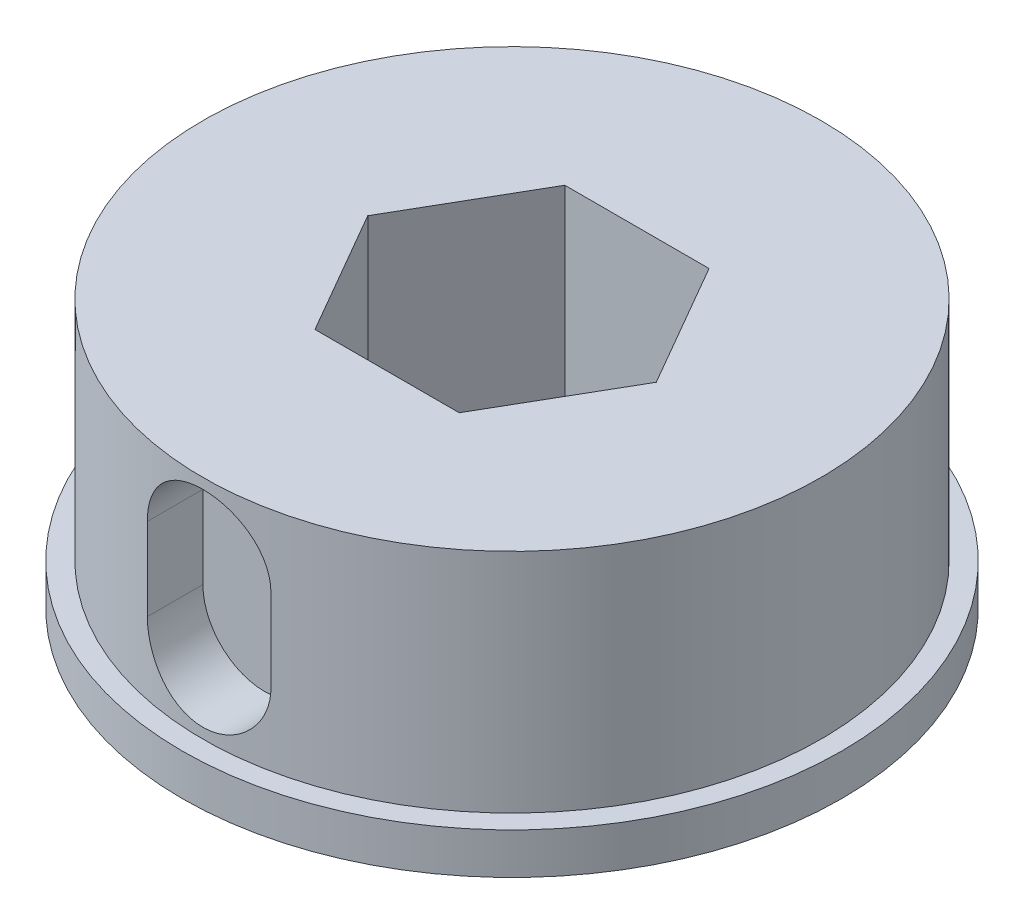
ISO-10303-21;
HEADER;
FILE_DESCRIPTION(('STEP AP214'),'2;1');
FILE_NAME('part.step','',(''),(''),'','','');
FILE_SCHEMA(('AUTOMOTIVE_DESIGN { 1 0 10303 214 1 1 1 1 }'));
ENDSEC;
DATA;
#1=APPLICATION_CONTEXT('core data for automotive mechanical design processes');
#2=APPLICATION_PROTOCOL_DEFINITION('international standard','automotive_design',2000,#1);
#3=PRODUCT_CONTEXT('',#1,'mechanical');
#4=PRODUCT('Part','Part','',(#3));
#5=PRODUCT_RELATED_PRODUCT_CATEGORY('part','',(#4));
#6=PRODUCT_DEFINITION_FORMATION('','',#4);
#7=PRODUCT_DEFINITION_CONTEXT('part definition',#1,'design');
#8=PRODUCT_DEFINITION('design','',#6,#7);
#9=PRODUCT_DEFINITION_SHAPE('','',#8);
#10=(LENGTH_UNIT() NAMED_UNIT(*) SI_UNIT(.MILLI.,.METRE.));
#11=(NAMED_UNIT(*) PLANE_ANGLE_UNIT() SI_UNIT($,.RADIAN.));
#12=(NAMED_UNIT(*) SI_UNIT($,.STERADIAN.) SOLID_ANGLE_UNIT());
#13=UNCERTAINTY_MEASURE_WITH_UNIT(LENGTH_MEASURE(1.E-05),#10,'distance_accuracy_value','');
#14=(GEOMETRIC_REPRESENTATION_CONTEXT(3) GLOBAL_UNCERTAINTY_ASSIGNED_CONTEXT((#13)) GLOBAL_UNIT_ASSIGNED_CONTEXT((#10,
#11,#12)) REPRESENTATION_CONTEXT('',''));
#15=CARTESIAN_POINT('',(0.,0.,0.));
#16=DIRECTION('',(0.,0.,1.));
#17=DIRECTION('',(1.,0.,0.));
#18=AXIS2_PLACEMENT_3D('',#15,#16,#17);
#19=CARTESIAN_POINT('',(0.,13.,0.));
#20=DIRECTION('',(0.,1.,0.));
#21=DIRECTION('',(0.,0.,1.));
#22=AXIS2_PLACEMENT_3D('',#19,#20,#21);
#23=PLANE('',#22);
#24=DIRECTION('',(-0.5,0.,0.866025403784438));
#25=VECTOR('',#24,1.);
#26=CARTESIAN_POINT('',(-3.5,13.,-6.06217782649107));
#27=LINE('',#26,#25);
#28=CARTESIAN_POINT('',(-3.5,13.,-6.06217782649107));
#29=VERTEX_POINT('',#28);
#30=CARTESIAN_POINT('',(-7.,13.,0.));
#31=VERTEX_POINT('',#30);
#32=EDGE_CURVE('E61',#29,#31,#27,.T.);
#33=ORIENTED_EDGE('',*,*,#32,.F.);
#34=DIRECTION('',(-1.,0.,0.));
#35=VECTOR('',#34,1.);
#36=CARTESIAN_POINT('',(3.5,13.,-6.06217782649107));
#37=LINE('',#36,#35);
#38=CARTESIAN_POINT('',(3.5,13.,-6.06217782649107));
#39=VERTEX_POINT('',#38);
#40=EDGE_CURVE('E158',#39,#29,#37,.T.);
#41=ORIENTED_EDGE('',*,*,#40,.F.);
#42=DIRECTION('',(-0.5,0.,-0.866025403784439));
#43=VECTOR('',#42,1.);
#44=CARTESIAN_POINT('',(7.,13.,0.));
#45=LINE('',#44,#43);
#46=CARTESIAN_POINT('',(7.,13.,0.));
#47=VERTEX_POINT('',#46);
#48=EDGE_CURVE('E193',#47,#39,#45,.T.);
#49=ORIENTED_EDGE('',*,*,#48,.F.);
#50=DIRECTION('',(0.500000000000001,0.,-0.866025403784438));
#51=VECTOR('',#50,1.);
#52=CARTESIAN_POINT('',(3.49999999999999,13.,6.06217782649107));
#53=LINE('',#52,#51);
#54=CARTESIAN_POINT('',(3.49999999999999,13.,6.06217782649107));
#55=VERTEX_POINT('',#54);
#56=EDGE_CURVE('E189',#55,#47,#53,.T.);
#57=ORIENTED_EDGE('',*,*,#56,.F.);
#58=DIRECTION('',(1.,0.,0.));
#59=VECTOR('',#58,1.);
#60=CARTESIAN_POINT('',(-3.5,13.,6.06217782649107));
#61=LINE('',#60,#59);
#62=CARTESIAN_POINT('',(-3.5,13.,6.06217782649107));
#63=VERTEX_POINT('',#62);
#64=EDGE_CURVE('E185',#63,#55,#61,.T.);
#65=ORIENTED_EDGE('',*,*,#64,.F.);
#66=DIRECTION('',(0.5,0.,0.866025403784439));
#67=VECTOR('',#66,1.);
#68=CARTESIAN_POINT('',(-7.,13.,0.));
#69=LINE('',#68,#67);
#70=EDGE_CURVE('E181',#31,#63,#69,.T.);
#71=ORIENTED_EDGE('',*,*,#70,.F.);
#72=EDGE_LOOP('',(#33,#41,#49,#57,#65,#71));
#73=FACE_BOUND('',#72,.T.);
#74=CARTESIAN_POINT('',(0.,13.,0.));
#75=DIRECTION('',(0.,-1.,0.));
#76=DIRECTION('',(0.,0.,-1.));
#77=AXIS2_PLACEMENT_3D('',#74,#75,#76);
#78=CIRCLE('',#77,15.);
#79=CARTESIAN_POINT('',(0.,13.,-15.));
#80=VERTEX_POINT('',#79);
#81=EDGE_CURVE('E229',#80,#80,#78,.T.);
#82=ORIENTED_EDGE('',*,*,#81,.F.);
#83=EDGE_LOOP('',(#82));
#84=FACE_BOUND('',#83,.T.);
#85=ADVANCED_FACE('F39',(#73,#84),#23,.T.);
#86=CARTESIAN_POINT('',(0.,0.,0.));
#87=DIRECTION('',(0.,-1.,0.));
#88=DIRECTION('',(0.,0.,-1.));
#89=AXIS2_PLACEMENT_3D('',#86,#87,#88);
#90=CYLINDRICAL_SURFACE('',#89,15.);
#91=CARTESIAN_POINT('',(-3.,5.5,14.6969384566991));
#92=CARTESIAN_POINT('',(-3.0000090632729,5.41652319142146,14.6969312244577));
#93=CARTESIAN_POINT('',(-2.99651591463672,5.33305138973831,14.6976495056175));
#94=CARTESIAN_POINT('',(-2.98259549441824,5.16672190003094,14.7004835434339));
#95=CARTESIAN_POINT('',(-2.97216908062491,5.08386413731945,14.7025991272148));
#96=CARTESIAN_POINT('',(-2.94447346178658,4.91947090401734,14.708170006848));
#97=CARTESIAN_POINT('',(-2.92721468106147,4.8379336151037,14.7116232616092));
#98=CARTESIAN_POINT('',(-2.88600721568467,4.67665358729654,14.7197622168639));
#99=CARTESIAN_POINT('',(-2.86205850372287,4.59691085573031,14.7244479223887));
#100=CARTESIAN_POINT('',(-2.78041527952091,4.36119429438503,14.7401631005323));
#101=CARTESIAN_POINT('',(-2.71290158046862,4.20860194204345,14.7528553636172));
#102=CARTESIAN_POINT('',(-2.55375565119918,3.91697261725373,14.7812320879208));
#103=CARTESIAN_POINT('',(-2.46212092124304,3.77793705178617,14.7969168592162));
#104=CARTESIAN_POINT('',(-2.25594334606256,3.51532942204371,14.829758124629));
#105=CARTESIAN_POINT('',(-2.14112719277709,3.39197354751699,14.8469306312349));
#106=CARTESIAN_POINT('',(-1.89243128558792,3.16613428756158,14.8806728038384));
#107=CARTESIAN_POINT('',(-1.75854858340981,3.06365413612862,14.8972423761055));
#108=CARTESIAN_POINT('',(-1.47408029245692,2.88163394701367,14.9280843032166));
#109=CARTESIAN_POINT('',(-1.32335950974471,2.80230126638314,14.9423354158867));
#110=CARTESIAN_POINT('',(-1.01040357091221,2.67017217235637,14.9667526662081));
#111=CARTESIAN_POINT('',(-0.848170122016177,2.61737183379913,14.9769194080515));
#112=CARTESIAN_POINT('',(-0.519052235967758,2.54047890031659,14.9919095326336));
#113=CARTESIAN_POINT('',(-0.352257106220375,2.5160176437936,14.996801475465));
#114=CARTESIAN_POINT('',(-0.0168596277551957,2.49534704944041,15.0009276525647));
#115=CARTESIAN_POINT('',(0.151742587839112,2.49913564460563,15.0001623007697));
#116=CARTESIAN_POINT('',(0.483426607616181,2.53457860432744,14.9931130332671));
#117=CARTESIAN_POINT('',(0.646552839896437,2.56583515057533,14.9869079049386));
#118=CARTESIAN_POINT('',(0.965196019837504,2.65469553006709,14.9697652350655));
#119=CARTESIAN_POINT('',(1.12071271847092,2.71230022493534,14.9588275387594));
#120=CARTESIAN_POINT('',(1.42086081389148,2.8525912107189,14.9333186736123));
#121=CARTESIAN_POINT('',(1.56541718043671,2.9354337608403,14.918724971732));
#122=CARTESIAN_POINT('',(1.83871931366189,3.12373081076761,14.8875135488761));
#123=CARTESIAN_POINT('',(1.96746376866397,3.22918718451439,14.8708956602115));
#124=CARTESIAN_POINT('',(2.20783861961223,3.46188508489282,14.8371311210549));
#125=CARTESIAN_POINT('',(2.31913408498718,3.58947220621929,14.8199802972521));
#126=CARTESIAN_POINT('',(2.51883269969928,3.86171427546206,14.7873511834928));
#127=CARTESIAN_POINT('',(2.60722950726484,4.00637393549751,14.7718733575622));
#128=CARTESIAN_POINT('',(2.75873986393405,4.30915721483898,14.7443319012696));
#129=CARTESIAN_POINT('',(2.82178462990343,4.46731607019005,14.7322775849504));
#130=CARTESIAN_POINT('',(2.9202212919898,4.79217589376674,14.7130848318748));
#131=CARTESIAN_POINT('',(2.95565438245299,4.95886373994435,14.7059390738486));
#132=CARTESIAN_POINT('',(2.98449881436589,5.18907045053933,14.7000953157589));
#133=CARTESIAN_POINT('',(2.99031376696653,5.25116241934733,14.6989127961598));
#134=CARTESIAN_POINT('',(2.99805949399395,5.37549359241226,14.6973350216032));
#135=CARTESIAN_POINT('',(2.99999676871396,5.43773237486735,14.6969384491447));
#136=CARTESIAN_POINT('',(3.,5.5,14.6969384566991));
#137=B_SPLINE_CURVE_WITH_KNOTS('',3,(#91,#92,#93,#94,#95,#96,#97,#98,#99,#100,#101,#102,#103,
#104,#105,#106,#107,#108,#109,#110,#111,#112,#113,#114,#115,#116,#117,#118,#119,#120,#121,#122,
#123,#124,#125,#126,#127,#128,#129,#130,#131,#132,#133,#134,#135,#136),.UNSPECIFIED.,.F.,.F.,(4,
2,2,2,2,2,2,2,2,2,2,2,2,2,2,2,2,2,2,2,2,2,4),(0.,0.250345531073763,0.500660094964607,
0.750594210284376,1.00052934591733,1.5000082936227,1.99953902430944,2.50534477833306,
3.01122883056535,3.52151451068939,4.03172467755666,4.53522025544509,5.03867899358442,
5.53496413269304,6.03126550223829,6.53070440104676,7.03018470288859,7.53831354930086,
8.04658297164637,8.55622223384239,9.06509969273805,9.25212746067475,9.43884144366995),.UNSPECIFIED.);
#138=CARTESIAN_POINT('',(-3.,5.5,14.6969384566991));
#139=VERTEX_POINT('',#138);
#140=CARTESIAN_POINT('',(3.,5.5,14.6969384566991));
#141=VERTEX_POINT('',#140);
#142=EDGE_CURVE('E233',#139,#141,#137,.T.);
#143=ORIENTED_EDGE('',*,*,#142,.F.);
#144=DIRECTION('',(0.,-1.,0.));
#145=VECTOR('',#144,1.);
#146=CARTESIAN_POINT('',(-3.,0.,14.6969384566991));
#147=LINE('',#146,#145);
#148=CARTESIAN_POINT('',(-3.,9.5,14.6969384566991));
#149=VERTEX_POINT('',#148);
#150=EDGE_CURVE('E11',#149,#139,#147,.T.);
#151=ORIENTED_EDGE('',*,*,#150,.F.);
#152=CARTESIAN_POINT('',(3.,9.50000000000001,14.6969384566991));
#153=CARTESIAN_POINT('',(3.00000906327289,9.58347680857855,14.6969312244577));
#154=CARTESIAN_POINT('',(2.99651591463671,9.6669486102617,14.6976495056175));
#155=CARTESIAN_POINT('',(2.98259549441823,9.83327809996907,14.7004835434339));
#156=CARTESIAN_POINT('',(2.97216908062491,9.91613586268056,14.7025991272148));
#157=CARTESIAN_POINT('',(2.94447346178657,10.0805290959827,14.708170006848));
#158=CARTESIAN_POINT('',(2.92721468106147,10.1620663848963,14.7116232616092));
#159=CARTESIAN_POINT('',(2.88600721568466,10.3233464127035,14.7197622168639));
#160=CARTESIAN_POINT('',(2.86205850372286,10.4030891442697,14.7244479223887));
#161=CARTESIAN_POINT('',(2.7804152795209,10.638805705615,14.7401631005323));
#162=CARTESIAN_POINT('',(2.71290158046861,10.7913980579566,14.7528553636172));
#163=CARTESIAN_POINT('',(2.55375565119917,11.0830273827463,14.7812320879208));
#164=CARTESIAN_POINT('',(2.46212092124303,11.2220629482138,14.7969168592162));
#165=CARTESIAN_POINT('',(2.25594334606254,11.4846705779563,14.829758124629));
#166=CARTESIAN_POINT('',(2.14112719277708,11.608026452483,14.8469306312349));
#167=CARTESIAN_POINT('',(1.8924312855879,11.8338657124384,14.8806728038384));
#168=CARTESIAN_POINT('',(1.7585485834098,11.9363458638714,14.8972423761055));
#169=CARTESIAN_POINT('',(1.47408029245691,12.1183660529863,14.9280843032166));
#170=CARTESIAN_POINT('',(1.32335950974469,12.1976987336169,14.9423354158867));
#171=CARTESIAN_POINT('',(1.01040357091219,12.3298278276436,14.9667526662081));
#172=CARTESIAN_POINT('',(0.848170122016159,12.3826281662009,14.9769194080515));
#173=CARTESIAN_POINT('',(0.51905223596774,12.4595210996834,14.9919095326336));
#174=CARTESIAN_POINT('',(0.352257106220357,12.4839823562064,14.996801475465));
#175=CARTESIAN_POINT('',(0.0168596277551778,12.5046529505596,15.0009276525647));
#176=CARTESIAN_POINT('',(-0.15174258783913,12.5008643553944,15.0001623007697));
#177=CARTESIAN_POINT('',(-0.483426607616199,12.4654213956726,14.9931130332671));
#178=CARTESIAN_POINT('',(-0.646552839896454,12.4341648494247,14.9869079049386));
#179=CARTESIAN_POINT('',(-0.965196019837522,12.3453044699329,14.9697652350655));
#180=CARTESIAN_POINT('',(-1.12071271847093,12.2876997750647,14.9588275387594));
#181=CARTESIAN_POINT('',(-1.4208608138915,12.1474087892811,14.9333186736123));
#182=CARTESIAN_POINT('',(-1.56541718043672,12.0645662391597,14.918724971732));
#183=CARTESIAN_POINT('',(-1.8387193136619,11.8762691892324,14.8875135488761));
#184=CARTESIAN_POINT('',(-1.96746376866399,11.7708128154856,14.8708956602115));
#185=CARTESIAN_POINT('',(-2.20783861961224,11.5381149151072,14.8371311210549));
#186=CARTESIAN_POINT('',(-2.3191340849872,11.4105277937807,14.8199802972521));
#187=CARTESIAN_POINT('',(-2.51883269969929,11.1382857245379,14.7873511834928));
#188=CARTESIAN_POINT('',(-2.60722950726485,10.9936260645025,14.7718733575622));
#189=CARTESIAN_POINT('',(-2.75873986393406,10.690842785161,14.7443319012696));
#190=CARTESIAN_POINT('',(-2.82178462990344,10.5326839298099,14.7322775849504));
#191=CARTESIAN_POINT('',(-2.92022129198981,10.2078241062333,14.7130848318748));
#192=CARTESIAN_POINT('',(-2.955654382453,10.0411362600556,14.7059390738486));
#193=CARTESIAN_POINT('',(-2.9844988143659,9.81092954946066,14.7000953157589));
#194=CARTESIAN_POINT('',(-2.99031376696654,9.74883758065267,14.6989127961598));
#195=CARTESIAN_POINT('',(-2.99805949399396,9.62450640758774,14.6973350216032));
#196=CARTESIAN_POINT('',(-2.99999676871397,9.56226762513266,14.6969384491447));
#197=CARTESIAN_POINT('',(-3.,9.5,14.6969384566991));
#198=B_SPLINE_CURVE_WITH_KNOTS('',3,(#152,#153,#154,#155,#156,#157,#158,#159,#160,#161,#162,
#163,#164,#165,#166,#167,#168,#169,#170,#171,#172,#173,#174,#175,#176,#177,#178,#179,#180,#181,
#182,#183,#184,#185,#186,#187,#188,#189,#190,#191,#192,#193,#194,#195,#196,#197),.UNSPECIFIED.,
.F.,.F.,(4,2,2,2,2,2,2,2,2,2,2,2,2,2,2,2,2,2,2,2,2,2,4),(0.,0.250345531073763,0.500660094964607,
0.750594210284378,1.00052934591733,1.5000082936227,1.99953902430944,2.50534477833307,
3.01122883056536,3.52151451068939,4.03172467755667,4.53522025544509,5.03867899358442,
5.53496413269305,6.03126550223829,6.53070440104676,7.03018470288859,7.53831354930087,
8.04658297164638,8.5562222338424,9.06509969273806,9.25212746067475,9.43884144366994),.UNSPECIFIED.);
#199=CARTESIAN_POINT('',(3.,9.50000000000001,14.6969384566991));
#200=VERTEX_POINT('',#199);
#201=EDGE_CURVE('E47',#200,#149,#198,.T.);
#202=ORIENTED_EDGE('',*,*,#201,.F.);
#203=DIRECTION('',(0.,-1.,0.));
#204=VECTOR('',#203,1.);
#205=CARTESIAN_POINT('',(3.,0.,14.6969384566991));
#206=LINE('',#205,#204);
#207=EDGE_CURVE('E241',#141,#200,#206,.F.);
#208=ORIENTED_EDGE('',*,*,#207,.F.);
#209=EDGE_LOOP('',(#143,#151,#202,#208));
#210=FACE_BOUND('',#209,.T.);
#211=ORIENTED_EDGE('',*,*,#81,.T.);
#212=EDGE_LOOP('',(#211));
#213=FACE_BOUND('',#212,.T.);
#214=CARTESIAN_POINT('',(0.,2.,0.));
#215=DIRECTION('',(0.,-1.,0.));
#216=DIRECTION('',(0.,0.,-1.));
#217=AXIS2_PLACEMENT_3D('',#214,#215,#216);
#218=CIRCLE('',#217,15.);
#219=CARTESIAN_POINT('',(0.,2.,-15.));
#220=VERTEX_POINT('',#219);
#221=EDGE_CURVE('E225',#220,#220,#218,.T.);
#222=ORIENTED_EDGE('',*,*,#221,.F.);
#223=EDGE_LOOP('',(#222));
#224=FACE_BOUND('',#223,.T.);
#225=ADVANCED_FACE('F242',(#210,#213,#224),#90,.T.);
#226=CARTESIAN_POINT('',(15.,2.,0.));
#227=DIRECTION('',(0.,1.,0.));
#228=DIRECTION('',(0.,0.,1.));
#229=AXIS2_PLACEMENT_3D('',#226,#227,#228);
#230=PLANE('',#229);
#231=ORIENTED_EDGE('',*,*,#221,.T.);
#232=EDGE_LOOP('',(#231));
#233=FACE_BOUND('',#232,.T.);
#234=CARTESIAN_POINT('',(0.,2.,0.));
#235=DIRECTION('',(0.,-1.,0.));
#236=DIRECTION('',(0.,0.,-1.));
#237=AXIS2_PLACEMENT_3D('',#234,#235,#236);
#238=CIRCLE('',#237,16.);
#239=CARTESIAN_POINT('',(0.,2.,-16.));
#240=VERTEX_POINT('',#239);
#241=EDGE_CURVE('E221',#240,#240,#238,.T.);
#242=ORIENTED_EDGE('',*,*,#241,.F.);
#243=EDGE_LOOP('',(#242));
#244=FACE_BOUND('',#243,.T.);
#245=ADVANCED_FACE('F273',(#233,#244),#230,.T.);
#246=CARTESIAN_POINT('',(0.,0.,0.));
#247=DIRECTION('',(0.,-1.,0.));
#248=DIRECTION('',(0.,0.,-1.));
#249=AXIS2_PLACEMENT_3D('',#246,#247,#248);
#250=CYLINDRICAL_SURFACE('',#249,16.);
#251=ORIENTED_EDGE('',*,*,#241,.T.);
#252=EDGE_LOOP('',(#251));
#253=FACE_BOUND('',#252,.T.);
#254=CARTESIAN_POINT('',(0.,0.,0.));
#255=DIRECTION('',(0.,-1.,0.));
#256=DIRECTION('',(0.,0.,-1.));
#257=AXIS2_PLACEMENT_3D('',#254,#255,#256);
#258=CIRCLE('',#257,16.);
#259=CARTESIAN_POINT('',(0.,0.,-16.));
#260=VERTEX_POINT('',#259);
#261=EDGE_CURVE('E203',#260,#260,#258,.T.);
#262=ORIENTED_EDGE('',*,*,#261,.F.);
#263=EDGE_LOOP('',(#262));
#264=FACE_BOUND('',#263,.T.);
#265=ADVANCED_FACE('F280',(#253,#264),#250,.T.);
#266=CARTESIAN_POINT('',(16.,0.,0.));
#267=DIRECTION('',(0.,-1.,0.));
#268=DIRECTION('',(0.,0.,-1.));
#269=AXIS2_PLACEMENT_3D('',#266,#267,#268);
#270=PLANE('',#269);
#271=DIRECTION('',(-0.5,0.,0.866025403784438));
#272=VECTOR('',#271,1.);
#273=CARTESIAN_POINT('',(-3.5,0.,-6.06217782649107));
#274=LINE('',#273,#272);
#275=CARTESIAN_POINT('',(-3.5,0.,-6.06217782649107));
#276=VERTEX_POINT('',#275);
#277=CARTESIAN_POINT('',(-7.,0.,0.));
#278=VERTEX_POINT('',#277);
#279=EDGE_CURVE('E153',#276,#278,#274,.T.);
#280=ORIENTED_EDGE('',*,*,#279,.T.);
#281=DIRECTION('',(0.5,0.,0.866025403784439));
#282=VECTOR('',#281,1.);
#283=CARTESIAN_POINT('',(-7.,0.,0.));
#284=LINE('',#283,#282);
#285=CARTESIAN_POINT('',(-3.5,0.,6.06217782649107));
#286=VERTEX_POINT('',#285);
#287=EDGE_CURVE('E157',#278,#286,#284,.T.);
#288=ORIENTED_EDGE('',*,*,#287,.T.);
#289=DIRECTION('',(1.,0.,0.));
#290=VECTOR('',#289,1.);
#291=CARTESIAN_POINT('',(-3.5,0.,6.06217782649107));
#292=LINE('',#291,#290);
#293=CARTESIAN_POINT('',(3.49999999999999,0.,6.06217782649107));
#294=VERTEX_POINT('',#293);
#295=EDGE_CURVE('E162',#286,#294,#292,.T.);
#296=ORIENTED_EDGE('',*,*,#295,.T.);
#297=DIRECTION('',(0.500000000000001,0.,-0.866025403784438));
#298=VECTOR('',#297,1.);
#299=CARTESIAN_POINT('',(3.49999999999999,0.,6.06217782649107));
#300=LINE('',#299,#298);
#301=CARTESIAN_POINT('',(7.,0.,0.));
#302=VERTEX_POINT('',#301);
#303=EDGE_CURVE('E166',#294,#302,#300,.T.);
#304=ORIENTED_EDGE('',*,*,#303,.T.);
#305=DIRECTION('',(-0.5,0.,-0.866025403784439));
#306=VECTOR('',#305,1.);
#307=CARTESIAN_POINT('',(7.,0.,0.));
#308=LINE('',#307,#306);
#309=CARTESIAN_POINT('',(3.5,0.,-6.06217782649107));
#310=VERTEX_POINT('',#309);
#311=EDGE_CURVE('E170',#302,#310,#308,.T.);
#312=ORIENTED_EDGE('',*,*,#311,.T.);
#313=DIRECTION('',(-1.,0.,0.));
#314=VECTOR('',#313,1.);
#315=CARTESIAN_POINT('',(3.5,0.,-6.06217782649107));
#316=LINE('',#315,#314);
#317=EDGE_CURVE('E174',#310,#276,#316,.T.);
#318=ORIENTED_EDGE('',*,*,#317,.T.);
#319=EDGE_LOOP('',(#280,#288,#296,#304,#312,#318));
#320=FACE_BOUND('',#319,.T.);
#321=ORIENTED_EDGE('',*,*,#261,.T.);
#322=EDGE_LOOP('',(#321));
#323=FACE_BOUND('',#322,.T.);
#324=ADVANCED_FACE('F285',(#320,#323),#270,.T.);
#325=CARTESIAN_POINT('',(-3.5,0.,-6.06217782649107));
#326=DIRECTION('',(-0.866025403784439,0.,-0.5));
#327=DIRECTION('',(-0.5,0.,0.866025403784439));
#328=AXIS2_PLACEMENT_3D('',#325,#326,#327);
#329=PLANE('',#328);
#330=ORIENTED_EDGE('',*,*,#32,.T.);
#331=DIRECTION('',(0.,1.,0.));
#332=VECTOR('',#331,1.);
#333=CARTESIAN_POINT('',(-7.,0.,0.));
#334=LINE('',#333,#332);
#335=EDGE_CURVE('E178',#278,#31,#334,.T.);
#336=ORIENTED_EDGE('',*,*,#335,.F.);
#337=ORIENTED_EDGE('',*,*,#279,.F.);
#338=DIRECTION('',(0.,1.,0.));
#339=VECTOR('',#338,1.);
#340=CARTESIAN_POINT('',(-3.5,0.,-6.06217782649107));
#341=LINE('',#340,#339);
#342=EDGE_CURVE('E200',#276,#29,#341,.T.);
#343=ORIENTED_EDGE('',*,*,#342,.T.);
#344=EDGE_LOOP('',(#330,#336,#337,#343));
#345=FACE_BOUND('',#344,.T.);
#346=ADVANCED_FACE('F290',(#345),#329,.F.);
#347=CARTESIAN_POINT('',(3.5,0.,-6.06217782649107));
#348=DIRECTION('',(0.,0.,-1.));
#349=DIRECTION('',(-1.,0.,0.));
#350=AXIS2_PLACEMENT_3D('',#347,#348,#349);
#351=PLANE('',#350);
#352=ORIENTED_EDGE('',*,*,#40,.T.);
#353=ORIENTED_EDGE('',*,*,#342,.F.);
#354=ORIENTED_EDGE('',*,*,#317,.F.);
#355=DIRECTION('',(0.,1.,0.));
#356=VECTOR('',#355,1.);
#357=CARTESIAN_POINT('',(3.5,0.,-6.06217782649107));
#358=LINE('',#357,#356);
#359=EDGE_CURVE('E204',#310,#39,#358,.T.);
#360=ORIENTED_EDGE('',*,*,#359,.T.);
#361=EDGE_LOOP('',(#352,#353,#354,#360));
#362=FACE_BOUND('',#361,.T.);
#363=ADVANCED_FACE('F259',(#362),#351,.F.);
#364=CARTESIAN_POINT('',(7.,0.,0.));
#365=DIRECTION('',(0.866025403784439,0.,-0.5));
#366=DIRECTION('',(-0.5,0.,-0.866025403784439));
#367=AXIS2_PLACEMENT_3D('',#364,#365,#366);
#368=PLANE('',#367);
#369=ORIENTED_EDGE('',*,*,#48,.T.);
#370=ORIENTED_EDGE('',*,*,#359,.F.);
#371=ORIENTED_EDGE('',*,*,#311,.F.);
#372=DIRECTION('',(0.,1.,0.));
#373=VECTOR('',#372,1.);
#374=CARTESIAN_POINT('',(7.,0.,0.));
#375=LINE('',#374,#373);
#376=EDGE_CURVE('E207',#302,#47,#375,.T.);
#377=ORIENTED_EDGE('',*,*,#376,.T.);
#378=EDGE_LOOP('',(#369,#370,#371,#377));
#379=FACE_BOUND('',#378,.T.);
#380=ADVANCED_FACE('F315',(#379),#368,.F.);
#381=CARTESIAN_POINT('',(3.49999999999999,0.,6.06217782649107));
#382=DIRECTION('',(0.866025403784438,0.,0.500000000000001));
#383=DIRECTION('',(0.500000000000001,0.,-0.866025403784438));
#384=AXIS2_PLACEMENT_3D('',#381,#382,#383);
#385=PLANE('',#384);
#386=ORIENTED_EDGE('',*,*,#56,.T.);
#387=ORIENTED_EDGE('',*,*,#376,.F.);
#388=ORIENTED_EDGE('',*,*,#303,.F.);
#389=DIRECTION('',(0.,1.,0.));
#390=VECTOR('',#389,1.);
#391=CARTESIAN_POINT('',(3.49999999999999,0.,6.06217782649107));
#392=LINE('',#391,#390);
#393=EDGE_CURVE('E210',#294,#55,#392,.T.);
#394=ORIENTED_EDGE('',*,*,#393,.T.);
#395=EDGE_LOOP('',(#386,#387,#388,#394));
#396=FACE_BOUND('',#395,.T.);
#397=ADVANCED_FACE('F317',(#396),#385,.F.);
#398=CARTESIAN_POINT('',(-3.5,0.,6.06217782649107));
#399=DIRECTION('',(0.,0.,1.));
#400=DIRECTION('',(1.,0.,0.));
#401=AXIS2_PLACEMENT_3D('',#398,#399,#400);
#402=PLANE('',#401);
#403=ORIENTED_EDGE('',*,*,#64,.T.);
#404=ORIENTED_EDGE('',*,*,#393,.F.);
#405=ORIENTED_EDGE('',*,*,#295,.F.);
#406=DIRECTION('',(0.,1.,0.));
#407=VECTOR('',#406,1.);
#408=CARTESIAN_POINT('',(-3.5,0.,6.06217782649107));
#409=LINE('',#408,#407);
#410=EDGE_CURVE('E213',#286,#63,#409,.T.);
#411=ORIENTED_EDGE('',*,*,#410,.T.);
#412=EDGE_LOOP('',(#403,#404,#405,#411));
#413=FACE_BOUND('',#412,.T.);
#414=ADVANCED_FACE('F320',(#413),#402,.F.);
#415=CARTESIAN_POINT('',(-7.,0.,0.));
#416=DIRECTION('',(-0.866025403784439,0.,0.5));
#417=DIRECTION('',(0.5,0.,0.866025403784439));
#418=AXIS2_PLACEMENT_3D('',#415,#416,#417);
#419=PLANE('',#418);
#420=ORIENTED_EDGE('',*,*,#70,.T.);
#421=ORIENTED_EDGE('',*,*,#410,.F.);
#422=ORIENTED_EDGE('',*,*,#287,.F.);
#423=ORIENTED_EDGE('',*,*,#335,.T.);
#424=EDGE_LOOP('',(#420,#421,#422,#423));
#425=FACE_BOUND('',#424,.T.);
#426=ADVANCED_FACE('F258',(#425),#419,.F.);
#427=CARTESIAN_POINT('',(0.,9.5,12.));
#428=DIRECTION('',(0.,0.,1.));
#429=DIRECTION('',(1.,0.,0.));
#430=AXIS2_PLACEMENT_3D('',#427,#428,#429);
#431=CYLINDRICAL_SURFACE('',#430,3.);
#432=DIRECTION('',(0.,0.,1.));
#433=VECTOR('',#432,1.);
#434=CARTESIAN_POINT('',(3.,9.50000000000001,12.));
#435=LINE('',#434,#433);
#436=CARTESIAN_POINT('',(3.,9.50000000000001,12.));
#437=VERTEX_POINT('',#436);
#438=EDGE_CURVE('E144',#437,#200,#435,.T.);
#439=ORIENTED_EDGE('',*,*,#438,.T.);
#440=ORIENTED_EDGE('',*,*,#201,.T.);
#441=DIRECTION('',(0.,0.,1.));
#442=VECTOR('',#441,1.);
#443=CARTESIAN_POINT('',(-3.,9.5,12.));
#444=LINE('',#443,#442);
#445=CARTESIAN_POINT('',(-3.,9.5,12.));
#446=VERTEX_POINT('',#445);
#447=EDGE_CURVE('E53',#446,#149,#444,.T.);
#448=ORIENTED_EDGE('',*,*,#447,.F.);
#449=CARTESIAN_POINT('',(0.,9.5,12.));
#450=DIRECTION('',(0.,0.,1.));
#451=DIRECTION('',(1.,0.,0.));
#452=AXIS2_PLACEMENT_3D('',#449,#450,#451);
#453=CIRCLE('',#452,3.);
#454=EDGE_CURVE('E118',#437,#446,#453,.T.);
#455=ORIENTED_EDGE('',*,*,#454,.F.);
#456=EDGE_LOOP('',(#439,#440,#448,#455));
#457=FACE_BOUND('',#456,.T.);
#458=ADVANCED_FACE('F116',(#457),#431,.F.);
#459=CARTESIAN_POINT('',(3.,9.50000000000001,12.));
#460=DIRECTION('',(1.,0.,0.));
#461=DIRECTION('',(0.,1.,0.));
#462=AXIS2_PLACEMENT_3D('',#459,#460,#461);
#463=PLANE('',#462);
#464=ORIENTED_EDGE('',*,*,#207,.T.);
#465=ORIENTED_EDGE('',*,*,#438,.F.);
#466=DIRECTION('',(0.,1.,0.));
#467=VECTOR('',#466,1.);
#468=CARTESIAN_POINT('',(3.,9.50000000000001,12.));
#469=LINE('',#468,#467);
#470=CARTESIAN_POINT('',(3.,5.5,12.));
#471=VERTEX_POINT('',#470);
#472=EDGE_CURVE('E123',#471,#437,#469,.T.);
#473=ORIENTED_EDGE('',*,*,#472,.F.);
#474=DIRECTION('',(0.,0.,1.));
#475=VECTOR('',#474,1.);
#476=CARTESIAN_POINT('',(3.,5.5,12.));
#477=LINE('',#476,#475);
#478=EDGE_CURVE('E147',#471,#141,#477,.T.);
#479=ORIENTED_EDGE('',*,*,#478,.T.);
#480=EDGE_LOOP('',(#464,#465,#473,#479));
#481=FACE_BOUND('',#480,.T.);
#482=ADVANCED_FACE('F250',(#481),#463,.F.);
#483=CARTESIAN_POINT('',(0.,5.5,12.));
#484=DIRECTION('',(0.,0.,1.));
#485=DIRECTION('',(1.,0.,0.));
#486=AXIS2_PLACEMENT_3D('',#483,#484,#485);
#487=CYLINDRICAL_SURFACE('',#486,3.);
#488=DIRECTION('',(0.,0.,1.));
#489=VECTOR('',#488,1.);
#490=CARTESIAN_POINT('',(-3.,5.5,12.));
#491=LINE('',#490,#489);
#492=CARTESIAN_POINT('',(-3.,5.5,12.));
#493=VERTEX_POINT('',#492);
#494=EDGE_CURVE('E122',#493,#139,#491,.T.);
#495=ORIENTED_EDGE('',*,*,#494,.T.);
#496=ORIENTED_EDGE('',*,*,#142,.T.);
#497=ORIENTED_EDGE('',*,*,#478,.F.);
#498=CARTESIAN_POINT('',(0.,5.5,12.));
#499=DIRECTION('',(0.,0.,1.));
#500=DIRECTION('',(1.,0.,0.));
#501=AXIS2_PLACEMENT_3D('',#498,#499,#500);
#502=CIRCLE('',#501,3.);
#503=EDGE_CURVE('E133',#493,#471,#502,.T.);
#504=ORIENTED_EDGE('',*,*,#503,.F.);
#505=EDGE_LOOP('',(#495,#496,#497,#504));
#506=FACE_BOUND('',#505,.T.);
#507=ADVANCED_FACE('F245',(#506),#487,.F.);
#508=CARTESIAN_POINT('',(-3.,9.5,12.));
#509=DIRECTION('',(-1.,0.,0.));
#510=DIRECTION('',(0.,-1.,0.));
#511=AXIS2_PLACEMENT_3D('',#508,#509,#510);
#512=PLANE('',#511);
#513=ORIENTED_EDGE('',*,*,#150,.T.);
#514=ORIENTED_EDGE('',*,*,#494,.F.);
#515=DIRECTION('',(0.,-1.,0.));
#516=VECTOR('',#515,1.);
#517=CARTESIAN_POINT('',(-3.,9.5,12.));
#518=LINE('',#517,#516);
#519=EDGE_CURVE('E126',#446,#493,#518,.T.);
#520=ORIENTED_EDGE('',*,*,#519,.F.);
#521=ORIENTED_EDGE('',*,*,#447,.T.);
#522=EDGE_LOOP('',(#513,#514,#520,#521));
#523=FACE_BOUND('',#522,.T.);
#524=ADVANCED_FACE('F127',(#523),#512,.F.);
#525=CARTESIAN_POINT('',(0.,9.5,12.));
#526=DIRECTION('',(0.,0.,1.));
#527=DIRECTION('',(1.,0.,0.));
#528=AXIS2_PLACEMENT_3D('',#525,#526,#527);
#529=PLANE('',#528);
#530=ORIENTED_EDGE('',*,*,#454,.T.);
#531=ORIENTED_EDGE('',*,*,#519,.T.);
#532=ORIENTED_EDGE('',*,*,#503,.T.);
#533=ORIENTED_EDGE('',*,*,#472,.T.);
#534=EDGE_LOOP('',(#530,#531,#532,#533));
#535=FACE_BOUND('',#534,.T.);
#536=ADVANCED_FACE('F135',(#535),#529,.T.);
#537=CLOSED_SHELL('',(#85,#225,#245,#265,#324,#346,#363,#380,#397,#414,#426,#458,#482,#507,#524,#536));
#538=MANIFOLD_SOLID_BREP('B2',#537);
#539=ADVANCED_BREP_SHAPE_REPRESENTATION('',(#18,#538),#14);
#540=SHAPE_DEFINITION_REPRESENTATION(#9,#539);
ENDSEC;
END-ISO-10303-21;
